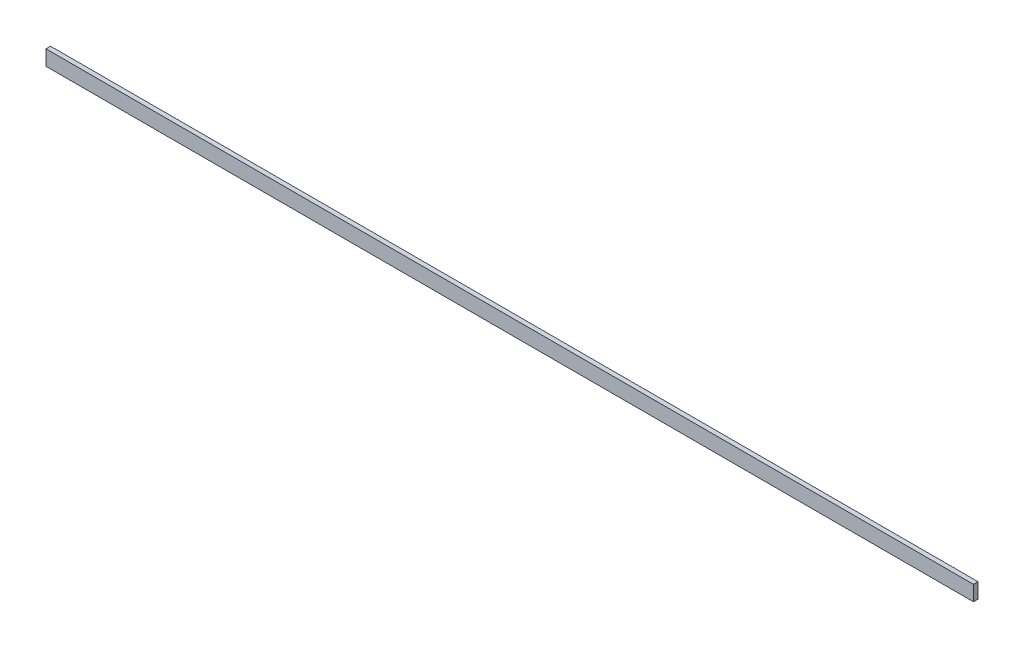
ISO-10303-21;
HEADER;
FILE_DESCRIPTION(('STEP AP214'),'2;1');
FILE_NAME('part.step','',(''),(''),'','','');
FILE_SCHEMA(('AUTOMOTIVE_DESIGN { 1 0 10303 214 1 1 1 1 }'));
ENDSEC;
DATA;
#1=APPLICATION_CONTEXT('core data for automotive mechanical design processes');
#2=APPLICATION_PROTOCOL_DEFINITION('international standard','automotive_design',2000,#1);
#3=PRODUCT_CONTEXT('',#1,'mechanical');
#4=PRODUCT('Part','Part','',(#3));
#5=PRODUCT_RELATED_PRODUCT_CATEGORY('part','',(#4));
#6=PRODUCT_DEFINITION_FORMATION('','',#4);
#7=PRODUCT_DEFINITION_CONTEXT('part definition',#1,'design');
#8=PRODUCT_DEFINITION('design','',#6,#7);
#9=PRODUCT_DEFINITION_SHAPE('','',#8);
#10=(LENGTH_UNIT() NAMED_UNIT(*) SI_UNIT(.MILLI.,.METRE.));
#11=(NAMED_UNIT(*) PLANE_ANGLE_UNIT() SI_UNIT($,.RADIAN.));
#12=(NAMED_UNIT(*) SI_UNIT($,.STERADIAN.) SOLID_ANGLE_UNIT());
#13=UNCERTAINTY_MEASURE_WITH_UNIT(LENGTH_MEASURE(1.E-05),#10,'distance_accuracy_value','');
#14=(GEOMETRIC_REPRESENTATION_CONTEXT(3) GLOBAL_UNCERTAINTY_ASSIGNED_CONTEXT((#13)) GLOBAL_UNIT_ASSIGNED_CONTEXT((#10,
#11,#12)) REPRESENTATION_CONTEXT('',''));
#15=CARTESIAN_POINT('',(0.,0.,0.));
#16=DIRECTION('',(0.,0.,1.));
#17=DIRECTION('',(1.,0.,0.));
#18=AXIS2_PLACEMENT_3D('',#15,#16,#17);
#19=CARTESIAN_POINT('',(0.,10.,3.));
#20=DIRECTION('',(0.,1.,0.));
#21=DIRECTION('',(-1.,0.,0.));
#22=AXIS2_PLACEMENT_3D('',#19,#20,#21);
#23=PLANE('',#22);
#24=DIRECTION('',(1.,0.,0.));
#25=VECTOR('',#24,1.);
#26=CARTESIAN_POINT('',(0.,10.,0.));
#27=LINE('',#26,#25);
#28=CARTESIAN_POINT('',(0.,10.,0.));
#29=VERTEX_POINT('',#28);
#30=CARTESIAN_POINT('',(612.,10.,0.));
#31=VERTEX_POINT('',#30);
#32=EDGE_CURVE('E114',#29,#31,#27,.T.);
#33=ORIENTED_EDGE('',*,*,#32,.F.);
#34=DIRECTION('',(0.,0.,-1.));
#35=VECTOR('',#34,1.);
#36=CARTESIAN_POINT('',(0.,10.,3.));
#37=LINE('',#36,#35);
#38=CARTESIAN_POINT('',(0.,10.,3.));
#39=VERTEX_POINT('',#38);
#40=EDGE_CURVE('E11',#39,#29,#37,.T.);
#41=ORIENTED_EDGE('',*,*,#40,.F.);
#42=DIRECTION('',(1.,0.,0.));
#43=VECTOR('',#42,1.);
#44=CARTESIAN_POINT('',(0.,10.,3.));
#45=LINE('',#44,#43);
#46=CARTESIAN_POINT('',(612.,10.,3.));
#47=VERTEX_POINT('',#46);
#48=EDGE_CURVE('E107',#39,#47,#45,.T.);
#49=ORIENTED_EDGE('',*,*,#48,.T.);
#50=DIRECTION('',(0.,0.,-1.));
#51=VECTOR('',#50,1.);
#52=CARTESIAN_POINT('',(612.,10.,3.));
#53=LINE('',#52,#51);
#54=EDGE_CURVE('E46',#47,#31,#53,.T.);
#55=ORIENTED_EDGE('',*,*,#54,.T.);
#56=EDGE_LOOP('',(#33,#41,#49,#55));
#57=FACE_BOUND('',#56,.T.);
#58=ADVANCED_FACE('F43',(#57),#23,.T.);
#59=CARTESIAN_POINT('',(0.,10.,3.));
#60=DIRECTION('',(1.,0.,0.));
#61=DIRECTION('',(0.,1.,0.));
#62=AXIS2_PLACEMENT_3D('',#59,#60,#61);
#63=PLANE('',#62);
#64=DIRECTION('',(0.,-1.,0.));
#65=VECTOR('',#64,1.);
#66=CARTESIAN_POINT('',(0.,10.,0.));
#67=LINE('',#66,#65);
#68=CARTESIAN_POINT('',(0.,0.,0.));
#69=VERTEX_POINT('',#68);
#70=EDGE_CURVE('E77',#29,#69,#67,.T.);
#71=ORIENTED_EDGE('',*,*,#70,.T.);
#72=DIRECTION('',(0.,0.,-1.));
#73=VECTOR('',#72,1.);
#74=CARTESIAN_POINT('',(0.,0.,3.));
#75=LINE('',#74,#73);
#76=CARTESIAN_POINT('',(0.,0.,3.));
#77=VERTEX_POINT('',#76);
#78=EDGE_CURVE('E53',#77,#69,#75,.T.);
#79=ORIENTED_EDGE('',*,*,#78,.F.);
#80=DIRECTION('',(0.,-1.,0.));
#81=VECTOR('',#80,1.);
#82=CARTESIAN_POINT('',(0.,10.,3.));
#83=LINE('',#82,#81);
#84=EDGE_CURVE('E92',#39,#77,#83,.T.);
#85=ORIENTED_EDGE('',*,*,#84,.F.);
#86=ORIENTED_EDGE('',*,*,#40,.T.);
#87=EDGE_LOOP('',(#71,#79,#85,#86));
#88=FACE_BOUND('',#87,.T.);
#89=ADVANCED_FACE('F130',(#88),#63,.F.);
#90=CARTESIAN_POINT('',(0.,0.,3.));
#91=DIRECTION('',(0.,1.,0.));
#92=DIRECTION('',(0.,0.,1.));
#93=AXIS2_PLACEMENT_3D('',#90,#91,#92);
#94=PLANE('',#93);
#95=DIRECTION('',(1.,0.,0.));
#96=VECTOR('',#95,1.);
#97=CARTESIAN_POINT('',(0.,0.,0.));
#98=LINE('',#97,#96);
#99=CARTESIAN_POINT('',(612.,0.,0.));
#100=VERTEX_POINT('',#99);
#101=EDGE_CURVE('E100',#69,#100,#98,.T.);
#102=ORIENTED_EDGE('',*,*,#101,.T.);
#103=DIRECTION('',(0.,0.,-1.));
#104=VECTOR('',#103,1.);
#105=CARTESIAN_POINT('',(612.,0.,3.));
#106=LINE('',#105,#104);
#107=CARTESIAN_POINT('',(612.,0.,3.));
#108=VERTEX_POINT('',#107);
#109=EDGE_CURVE('E97',#108,#100,#106,.T.);
#110=ORIENTED_EDGE('',*,*,#109,.F.);
#111=DIRECTION('',(1.,0.,0.));
#112=VECTOR('',#111,1.);
#113=CARTESIAN_POINT('',(0.,0.,3.));
#114=LINE('',#113,#112);
#115=EDGE_CURVE('E89',#77,#108,#114,.T.);
#116=ORIENTED_EDGE('',*,*,#115,.F.);
#117=ORIENTED_EDGE('',*,*,#78,.T.);
#118=EDGE_LOOP('',(#102,#110,#116,#117));
#119=FACE_BOUND('',#118,.T.);
#120=ADVANCED_FACE('F98',(#119),#94,.F.);
#121=CARTESIAN_POINT('',(612.,0.,3.));
#122=DIRECTION('',(-1.,0.,0.));
#123=DIRECTION('',(0.,0.,1.));
#124=AXIS2_PLACEMENT_3D('',#121,#122,#123);
#125=PLANE('',#124);
#126=DIRECTION('',(0.,1.,0.));
#127=VECTOR('',#126,1.);
#128=CARTESIAN_POINT('',(612.,0.,0.));
#129=LINE('',#128,#127);
#130=EDGE_CURVE('E118',#100,#31,#129,.T.);
#131=ORIENTED_EDGE('',*,*,#130,.T.);
#132=ORIENTED_EDGE('',*,*,#54,.F.);
#133=DIRECTION('',(0.,1.,0.));
#134=VECTOR('',#133,1.);
#135=CARTESIAN_POINT('',(612.,0.,3.));
#136=LINE('',#135,#134);
#137=EDGE_CURVE('E86',#108,#47,#136,.T.);
#138=ORIENTED_EDGE('',*,*,#137,.F.);
#139=ORIENTED_EDGE('',*,*,#109,.T.);
#140=EDGE_LOOP('',(#131,#132,#138,#139));
#141=FACE_BOUND('',#140,.T.);
#142=ADVANCED_FACE('F105',(#141),#125,.F.);
#143=CARTESIAN_POINT('',(0.,0.,3.));
#144=DIRECTION('',(0.,0.,1.));
#145=DIRECTION('',(1.,0.,0.));
#146=AXIS2_PLACEMENT_3D('',#143,#144,#145);
#147=PLANE('',#146);
#148=ORIENTED_EDGE('',*,*,#48,.F.);
#149=ORIENTED_EDGE('',*,*,#84,.T.);
#150=ORIENTED_EDGE('',*,*,#115,.T.);
#151=ORIENTED_EDGE('',*,*,#137,.T.);
#152=EDGE_LOOP('',(#148,#149,#150,#151));
#153=FACE_BOUND('',#152,.T.);
#154=ADVANCED_FACE('F91',(#153),#147,.T.);
#155=CARTESIAN_POINT('',(0.,0.,0.));
#156=DIRECTION('',(0.,0.,1.));
#157=DIRECTION('',(1.,0.,0.));
#158=AXIS2_PLACEMENT_3D('',#155,#156,#157);
#159=PLANE('',#158);
#160=ORIENTED_EDGE('',*,*,#32,.T.);
#161=ORIENTED_EDGE('',*,*,#130,.F.);
#162=ORIENTED_EDGE('',*,*,#101,.F.);
#163=ORIENTED_EDGE('',*,*,#70,.F.);
#164=EDGE_LOOP('',(#160,#161,#162,#163));
#165=FACE_BOUND('',#164,.T.);
#166=ADVANCED_FACE('F127',(#165),#159,.F.);
#167=CLOSED_SHELL('',(#58,#89,#120,#142,#154,#166));
#168=MANIFOLD_SOLID_BREP('B2',#167);
#169=ADVANCED_BREP_SHAPE_REPRESENTATION('',(#18,#168),#14);
#170=SHAPE_DEFINITION_REPRESENTATION(#9,#169);
ENDSEC;
END-ISO-10303-21;
